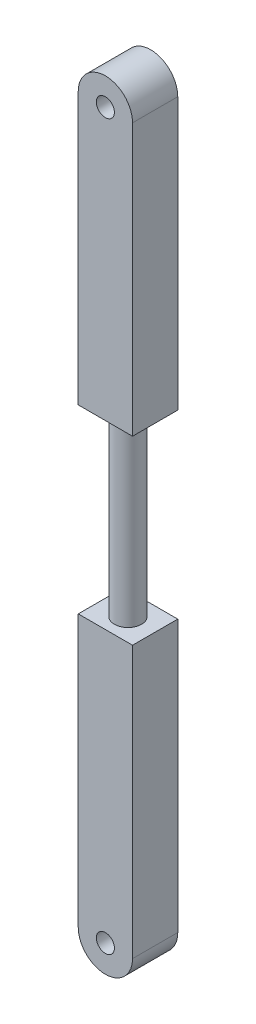
ISO-10303-21;
HEADER;
FILE_DESCRIPTION(('STEP AP214'),'2;1');
FILE_NAME('part.step','',(''),(''),'','','');
FILE_SCHEMA(('AUTOMOTIVE_DESIGN { 1 0 10303 214 1 1 1 1 }'));
ENDSEC;
DATA;
#1=APPLICATION_CONTEXT('core data for automotive mechanical design processes');
#2=APPLICATION_PROTOCOL_DEFINITION('international standard','automotive_design',2000,#1);
#3=PRODUCT_CONTEXT('',#1,'mechanical');
#4=PRODUCT('Part','Part','',(#3));
#5=PRODUCT_RELATED_PRODUCT_CATEGORY('part','',(#4));
#6=PRODUCT_DEFINITION_FORMATION('','',#4);
#7=PRODUCT_DEFINITION_CONTEXT('part definition',#1,'design');
#8=PRODUCT_DEFINITION('design','',#6,#7);
#9=PRODUCT_DEFINITION_SHAPE('','',#8);
#10=(LENGTH_UNIT() NAMED_UNIT(*) SI_UNIT(.MILLI.,.METRE.));
#11=(NAMED_UNIT(*) PLANE_ANGLE_UNIT() SI_UNIT($,.RADIAN.));
#12=(NAMED_UNIT(*) SI_UNIT($,.STERADIAN.) SOLID_ANGLE_UNIT());
#13=UNCERTAINTY_MEASURE_WITH_UNIT(LENGTH_MEASURE(1.E-05),#10,'distance_accuracy_value','');
#14=(GEOMETRIC_REPRESENTATION_CONTEXT(3) GLOBAL_UNCERTAINTY_ASSIGNED_CONTEXT((#13)) GLOBAL_UNIT_ASSIGNED_CONTEXT((#10,
#11,#12)) REPRESENTATION_CONTEXT('',''));
#15=CARTESIAN_POINT('',(0.,0.,0.));
#16=DIRECTION('',(0.,0.,1.));
#17=DIRECTION('',(1.,0.,0.));
#18=AXIS2_PLACEMENT_3D('',#15,#16,#17);
#19=CARTESIAN_POINT('',(0.,40.,2.5));
#20=DIRECTION('',(0.,0.,1.));
#21=DIRECTION('',(1.,0.,0.));
#22=AXIS2_PLACEMENT_3D('',#19,#20,#21);
#23=PLANE('',#22);
#24=CARTESIAN_POINT('',(0.,-40.,2.5));
#25=DIRECTION('',(0.,0.,1.));
#26=DIRECTION('',(1.,0.,0.));
#27=AXIS2_PLACEMENT_3D('',#24,#25,#26);
#28=CIRCLE('',#27,1.);
#29=CARTESIAN_POINT('',(1.,-40.,2.5));
#30=VERTEX_POINT('',#29);
#31=EDGE_CURVE('E172',#30,#30,#28,.T.);
#32=ORIENTED_EDGE('',*,*,#31,.F.);
#33=EDGE_LOOP('',(#32));
#34=FACE_BOUND('',#33,.T.);
#35=DIRECTION('',(0.,1.,0.));
#36=VECTOR('',#35,1.);
#37=CARTESIAN_POINT('',(3.,40.,2.5));
#38=LINE('',#37,#36);
#39=CARTESIAN_POINT('',(2.99999999999999,-40.,2.5));
#40=VERTEX_POINT('',#39);
#41=CARTESIAN_POINT('',(2.99999999999999,-10.,2.5));
#42=VERTEX_POINT('',#41);
#43=EDGE_CURVE('E120',#40,#42,#38,.T.);
#44=ORIENTED_EDGE('',*,*,#43,.T.);
#45=DIRECTION('',(-1.,0.,0.));
#46=VECTOR('',#45,1.);
#47=CARTESIAN_POINT('',(0.,-10.,2.5));
#48=LINE('',#47,#46);
#49=CARTESIAN_POINT('',(-3.,-10.,2.5));
#50=VERTEX_POINT('',#49);
#51=EDGE_CURVE('E51',#42,#50,#48,.T.);
#52=ORIENTED_EDGE('',*,*,#51,.T.);
#53=DIRECTION('',(0.,-1.,0.));
#54=VECTOR('',#53,1.);
#55=CARTESIAN_POINT('',(-3.,40.,2.5));
#56=LINE('',#55,#54);
#57=CARTESIAN_POINT('',(-3.,-40.,2.5));
#58=VERTEX_POINT('',#57);
#59=EDGE_CURVE('E182',#50,#58,#56,.T.);
#60=ORIENTED_EDGE('',*,*,#59,.T.);
#61=CARTESIAN_POINT('',(0.,-40.,2.5));
#62=DIRECTION('',(0.,0.,1.));
#63=DIRECTION('',(1.,0.,0.));
#64=AXIS2_PLACEMENT_3D('',#61,#62,#63);
#65=CIRCLE('',#64,3.);
#66=EDGE_CURVE('E121',#58,#40,#65,.T.);
#67=ORIENTED_EDGE('',*,*,#66,.T.);
#68=EDGE_LOOP('',(#44,#52,#60,#67));
#69=FACE_BOUND('',#68,.T.);
#70=ADVANCED_FACE('F37',(#34,#69),#23,.T.);
#71=CARTESIAN_POINT('',(0.,40.,-2.5));
#72=DIRECTION('',(0.,0.,1.));
#73=DIRECTION('',(1.,0.,0.));
#74=AXIS2_PLACEMENT_3D('',#71,#72,#73);
#75=PLANE('',#74);
#76=CARTESIAN_POINT('',(0.,-40.,-2.5));
#77=DIRECTION('',(0.,0.,1.));
#78=DIRECTION('',(1.,0.,0.));
#79=AXIS2_PLACEMENT_3D('',#76,#77,#78);
#80=CIRCLE('',#79,1.);
#81=CARTESIAN_POINT('',(1.,-40.,-2.5));
#82=VERTEX_POINT('',#81);
#83=EDGE_CURVE('E171',#82,#82,#80,.T.);
#84=ORIENTED_EDGE('',*,*,#83,.T.);
#85=EDGE_LOOP('',(#84));
#86=FACE_BOUND('',#85,.T.);
#87=DIRECTION('',(-1.,0.,0.));
#88=VECTOR('',#87,1.);
#89=CARTESIAN_POINT('',(0.,-10.,-2.5));
#90=LINE('',#89,#88);
#91=CARTESIAN_POINT('',(2.99999999999999,-10.,-2.5));
#92=VERTEX_POINT('',#91);
#93=CARTESIAN_POINT('',(-3.,-10.,-2.5));
#94=VERTEX_POINT('',#93);
#95=EDGE_CURVE('E166',#92,#94,#90,.T.);
#96=ORIENTED_EDGE('',*,*,#95,.F.);
#97=DIRECTION('',(0.,1.,0.));
#98=VECTOR('',#97,1.);
#99=CARTESIAN_POINT('',(3.,40.,-2.5));
#100=LINE('',#99,#98);
#101=CARTESIAN_POINT('',(2.99999999999999,-40.,-2.5));
#102=VERTEX_POINT('',#101);
#103=EDGE_CURVE('E138',#102,#92,#100,.T.);
#104=ORIENTED_EDGE('',*,*,#103,.F.);
#105=CARTESIAN_POINT('',(0.,-40.,-2.5));
#106=DIRECTION('',(0.,0.,1.));
#107=DIRECTION('',(1.,0.,0.));
#108=AXIS2_PLACEMENT_3D('',#105,#106,#107);
#109=CIRCLE('',#108,3.);
#110=CARTESIAN_POINT('',(-3.,-40.,-2.5));
#111=VERTEX_POINT('',#110);
#112=EDGE_CURVE('E135',#111,#102,#109,.T.);
#113=ORIENTED_EDGE('',*,*,#112,.F.);
#114=DIRECTION('',(0.,-1.,0.));
#115=VECTOR('',#114,1.);
#116=CARTESIAN_POINT('',(-3.,40.,-2.5));
#117=LINE('',#116,#115);
#118=EDGE_CURVE('E130',#94,#111,#117,.T.);
#119=ORIENTED_EDGE('',*,*,#118,.F.);
#120=EDGE_LOOP('',(#96,#104,#113,#119));
#121=FACE_BOUND('',#120,.T.);
#122=ADVANCED_FACE('F202',(#86,#121),#75,.F.);
#123=CARTESIAN_POINT('',(-3.,40.,2.5));
#124=DIRECTION('',(1.,0.,0.));
#125=DIRECTION('',(0.,1.,0.));
#126=AXIS2_PLACEMENT_3D('',#123,#124,#125);
#127=PLANE('',#126);
#128=DIRECTION('',(0.,0.,1.));
#129=VECTOR('',#128,1.);
#130=CARTESIAN_POINT('',(-3.00000000000001,-10.,2.5));
#131=LINE('',#130,#129);
#132=EDGE_CURVE('E169',#94,#50,#131,.T.);
#133=ORIENTED_EDGE('',*,*,#132,.F.);
#134=ORIENTED_EDGE('',*,*,#118,.T.);
#135=DIRECTION('',(0.,0.,-1.));
#136=VECTOR('',#135,1.);
#137=CARTESIAN_POINT('',(-3.,-40.,2.5));
#138=LINE('',#137,#136);
#139=EDGE_CURVE('E146',#58,#111,#138,.T.);
#140=ORIENTED_EDGE('',*,*,#139,.F.);
#141=ORIENTED_EDGE('',*,*,#59,.F.);
#142=EDGE_LOOP('',(#133,#134,#140,#141));
#143=FACE_BOUND('',#142,.T.);
#144=ADVANCED_FACE('F190',(#143),#127,.F.);
#145=CARTESIAN_POINT('',(3.,40.,2.5));
#146=DIRECTION('',(-1.,0.,0.));
#147=DIRECTION('',(0.,-1.,0.));
#148=AXIS2_PLACEMENT_3D('',#145,#146,#147);
#149=PLANE('',#148);
#150=DIRECTION('',(0.,0.,-1.));
#151=VECTOR('',#150,1.);
#152=CARTESIAN_POINT('',(2.99999999999999,-10.,2.5));
#153=LINE('',#152,#151);
#154=EDGE_CURVE('E11',#42,#92,#153,.T.);
#155=ORIENTED_EDGE('',*,*,#154,.F.);
#156=ORIENTED_EDGE('',*,*,#43,.F.);
#157=DIRECTION('',(0.,0.,-1.));
#158=VECTOR('',#157,1.);
#159=CARTESIAN_POINT('',(2.99999999999999,-40.,2.5));
#160=LINE('',#159,#158);
#161=EDGE_CURVE('E143',#40,#102,#160,.T.);
#162=ORIENTED_EDGE('',*,*,#161,.T.);
#163=ORIENTED_EDGE('',*,*,#103,.T.);
#164=EDGE_LOOP('',(#155,#156,#162,#163));
#165=FACE_BOUND('',#164,.T.);
#166=ADVANCED_FACE('F198',(#165),#149,.F.);
#167=CARTESIAN_POINT('',(0.,-40.,2.5));
#168=DIRECTION('',(0.,0.,-1.));
#169=DIRECTION('',(-1.,0.,0.));
#170=AXIS2_PLACEMENT_3D('',#167,#168,#169);
#171=CYLINDRICAL_SURFACE('',#170,3.);
#172=ORIENTED_EDGE('',*,*,#112,.T.);
#173=ORIENTED_EDGE('',*,*,#161,.F.);
#174=ORIENTED_EDGE('',*,*,#66,.F.);
#175=ORIENTED_EDGE('',*,*,#139,.T.);
#176=EDGE_LOOP('',(#172,#173,#174,#175));
#177=FACE_BOUND('',#176,.T.);
#178=ADVANCED_FACE('F194',(#177),#171,.T.);
#179=CARTESIAN_POINT('',(0.,-40.,2.5));
#180=DIRECTION('',(0.,0.,-1.));
#181=DIRECTION('',(-1.,0.,0.));
#182=AXIS2_PLACEMENT_3D('',#179,#180,#181);
#183=CYLINDRICAL_SURFACE('',#182,1.);
#184=ORIENTED_EDGE('',*,*,#31,.T.);
#185=EDGE_LOOP('',(#184));
#186=FACE_BOUND('',#185,.T.);
#187=ORIENTED_EDGE('',*,*,#83,.F.);
#188=EDGE_LOOP('',(#187));
#189=FACE_BOUND('',#188,.T.);
#190=ADVANCED_FACE('F226',(#186,#189),#183,.F.);
#191=CARTESIAN_POINT('',(0.,-10.,0.));
#192=DIRECTION('',(0.,1.,0.));
#193=DIRECTION('',(0.,0.,1.));
#194=AXIS2_PLACEMENT_3D('',#191,#192,#193);
#195=PLANE('',#194);
#196=CARTESIAN_POINT('',(0.,-10.,0.));
#197=DIRECTION('',(0.,1.,0.));
#198=DIRECTION('',(0.,0.,1.));
#199=AXIS2_PLACEMENT_3D('',#196,#197,#198);
#200=CIRCLE('',#199,1.5);
#201=CARTESIAN_POINT('',(0.,-10.,1.5));
#202=VERTEX_POINT('',#201);
#203=EDGE_CURVE('E158',#202,#202,#200,.T.);
#204=ORIENTED_EDGE('',*,*,#203,.F.);
#205=EDGE_LOOP('',(#204));
#206=FACE_BOUND('',#205,.T.);
#207=ORIENTED_EDGE('',*,*,#132,.T.);
#208=ORIENTED_EDGE('',*,*,#51,.F.);
#209=ORIENTED_EDGE('',*,*,#154,.T.);
#210=ORIENTED_EDGE('',*,*,#95,.T.);
#211=EDGE_LOOP('',(#207,#208,#209,#210));
#212=FACE_BOUND('',#211,.T.);
#213=ADVANCED_FACE('F200',(#206,#212),#195,.T.);
#214=CARTESIAN_POINT('',(0.,10.,0.));
#215=DIRECTION('',(0.,1.,0.));
#216=DIRECTION('',(0.,0.,1.));
#217=AXIS2_PLACEMENT_3D('',#214,#215,#216);
#218=PLANE('',#217);
#219=CARTESIAN_POINT('',(0.,10.,0.));
#220=DIRECTION('',(0.,1.,0.));
#221=DIRECTION('',(0.,0.,1.));
#222=AXIS2_PLACEMENT_3D('',#219,#220,#221);
#223=CIRCLE('',#222,1.5);
#224=CARTESIAN_POINT('',(0.,10.,1.5));
#225=VERTEX_POINT('',#224);
#226=EDGE_CURVE('E161',#225,#225,#223,.T.);
#227=ORIENTED_EDGE('',*,*,#226,.T.);
#228=EDGE_LOOP('',(#227));
#229=FACE_BOUND('',#228,.T.);
#230=DIRECTION('',(-1.,0.,0.));
#231=VECTOR('',#230,1.);
#232=CARTESIAN_POINT('',(0.,10.,-2.5));
#233=LINE('',#232,#231);
#234=CARTESIAN_POINT('',(3.,10.,-2.5));
#235=VERTEX_POINT('',#234);
#236=CARTESIAN_POINT('',(-3.,10.,-2.5));
#237=VERTEX_POINT('',#236);
#238=EDGE_CURVE('E59',#235,#237,#233,.T.);
#239=ORIENTED_EDGE('',*,*,#238,.F.);
#240=DIRECTION('',(0.,0.,-1.));
#241=VECTOR('',#240,1.);
#242=CARTESIAN_POINT('',(3.,10.,2.5));
#243=LINE('',#242,#241);
#244=CARTESIAN_POINT('',(3.,10.,2.5));
#245=VERTEX_POINT('',#244);
#246=EDGE_CURVE('E45',#245,#235,#243,.T.);
#247=ORIENTED_EDGE('',*,*,#246,.F.);
#248=DIRECTION('',(-1.,0.,0.));
#249=VECTOR('',#248,1.);
#250=CARTESIAN_POINT('',(0.,10.,2.5));
#251=LINE('',#250,#249);
#252=CARTESIAN_POINT('',(-3.,10.,2.5));
#253=VERTEX_POINT('',#252);
#254=EDGE_CURVE('E100',#245,#253,#251,.T.);
#255=ORIENTED_EDGE('',*,*,#254,.T.);
#256=DIRECTION('',(0.,0.,1.));
#257=VECTOR('',#256,1.);
#258=CARTESIAN_POINT('',(-3.,10.,2.5));
#259=LINE('',#258,#257);
#260=EDGE_CURVE('E114',#237,#253,#259,.T.);
#261=ORIENTED_EDGE('',*,*,#260,.F.);
#262=EDGE_LOOP('',(#239,#247,#255,#261));
#263=FACE_BOUND('',#262,.T.);
#264=ADVANCED_FACE('F99',(#229,#263),#218,.F.);
#265=CARTESIAN_POINT('',(0.,-10.,0.));
#266=DIRECTION('',(0.,1.,0.));
#267=DIRECTION('',(0.,0.,1.));
#268=AXIS2_PLACEMENT_3D('',#265,#266,#267);
#269=CYLINDRICAL_SURFACE('',#268,1.5);
#270=ORIENTED_EDGE('',*,*,#203,.T.);
#271=EDGE_LOOP('',(#270));
#272=FACE_BOUND('',#271,.T.);
#273=ORIENTED_EDGE('',*,*,#226,.F.);
#274=EDGE_LOOP('',(#273));
#275=FACE_BOUND('',#274,.T.);
#276=ADVANCED_FACE('F242',(#272,#275),#269,.T.);
#277=CARTESIAN_POINT('',(0.,40.,2.5));
#278=DIRECTION('',(0.,0.,-1.));
#279=DIRECTION('',(-1.,0.,0.));
#280=AXIS2_PLACEMENT_3D('',#277,#278,#279);
#281=CYLINDRICAL_SURFACE('',#280,1.);
#282=CARTESIAN_POINT('',(0.,40.,2.5));
#283=DIRECTION('',(0.,0.,1.));
#284=DIRECTION('',(1.,0.,0.));
#285=AXIS2_PLACEMENT_3D('',#282,#283,#284);
#286=CIRCLE('',#285,1.);
#287=CARTESIAN_POINT('',(1.,40.,2.5));
#288=VERTEX_POINT('',#287);
#289=EDGE_CURVE('E131',#288,#288,#286,.T.);
#290=ORIENTED_EDGE('',*,*,#289,.T.);
#291=EDGE_LOOP('',(#290));
#292=FACE_BOUND('',#291,.T.);
#293=CARTESIAN_POINT('',(0.,40.,-2.5));
#294=DIRECTION('',(0.,0.,1.));
#295=DIRECTION('',(1.,0.,0.));
#296=AXIS2_PLACEMENT_3D('',#293,#294,#295);
#297=CIRCLE('',#296,1.);
#298=CARTESIAN_POINT('',(1.,40.,-2.5));
#299=VERTEX_POINT('',#298);
#300=EDGE_CURVE('E175',#299,#299,#297,.T.);
#301=ORIENTED_EDGE('',*,*,#300,.F.);
#302=EDGE_LOOP('',(#301));
#303=FACE_BOUND('',#302,.T.);
#304=ADVANCED_FACE('F240',(#292,#303),#281,.F.);
#305=CARTESIAN_POINT('',(0.,40.,2.5));
#306=DIRECTION('',(0.,0.,-1.));
#307=DIRECTION('',(-1.,0.,0.));
#308=AXIS2_PLACEMENT_3D('',#305,#306,#307);
#309=CYLINDRICAL_SURFACE('',#308,3.);
#310=CARTESIAN_POINT('',(0.,40.,-2.5));
#311=DIRECTION('',(0.,0.,1.));
#312=DIRECTION('',(1.,0.,0.));
#313=AXIS2_PLACEMENT_3D('',#310,#311,#312);
#314=CIRCLE('',#313,3.);
#315=CARTESIAN_POINT('',(3.,40.,-2.5));
#316=VERTEX_POINT('',#315);
#317=CARTESIAN_POINT('',(-3.,40.,-2.5));
#318=VERTEX_POINT('',#317);
#319=EDGE_CURVE('E127',#316,#318,#314,.T.);
#320=ORIENTED_EDGE('',*,*,#319,.T.);
#321=DIRECTION('',(0.,0.,-1.));
#322=VECTOR('',#321,1.);
#323=CARTESIAN_POINT('',(-3.,40.,2.5));
#324=LINE('',#323,#322);
#325=CARTESIAN_POINT('',(-3.,40.,2.5));
#326=VERTEX_POINT('',#325);
#327=EDGE_CURVE('E105',#326,#318,#324,.T.);
#328=ORIENTED_EDGE('',*,*,#327,.F.);
#329=CARTESIAN_POINT('',(0.,40.,2.5));
#330=DIRECTION('',(0.,0.,1.));
#331=DIRECTION('',(1.,0.,0.));
#332=AXIS2_PLACEMENT_3D('',#329,#330,#331);
#333=CIRCLE('',#332,3.);
#334=CARTESIAN_POINT('',(3.,40.,2.5));
#335=VERTEX_POINT('',#334);
#336=EDGE_CURVE('E141',#335,#326,#333,.T.);
#337=ORIENTED_EDGE('',*,*,#336,.F.);
#338=DIRECTION('',(0.,0.,-1.));
#339=VECTOR('',#338,1.);
#340=CARTESIAN_POINT('',(3.,40.,2.5));
#341=LINE('',#340,#339);
#342=EDGE_CURVE('E118',#335,#316,#341,.T.);
#343=ORIENTED_EDGE('',*,*,#342,.T.);
#344=EDGE_LOOP('',(#320,#328,#337,#343));
#345=FACE_BOUND('',#344,.T.);
#346=ADVANCED_FACE('F39',(#345),#309,.T.);
#347=EDGE_CURVE('E132',#318,#237,#117,.T.);
#348=ORIENTED_EDGE('',*,*,#347,.T.);
#349=ORIENTED_EDGE('',*,*,#260,.T.);
#350=EDGE_CURVE('E113',#326,#253,#56,.T.);
#351=ORIENTED_EDGE('',*,*,#350,.F.);
#352=ORIENTED_EDGE('',*,*,#327,.T.);
#353=EDGE_LOOP('',(#348,#349,#351,#352));
#354=FACE_BOUND('',#353,.T.);
#355=ADVANCED_FACE('F152',(#354),#127,.F.);
#356=EDGE_CURVE('E111',#245,#335,#38,.T.);
#357=ORIENTED_EDGE('',*,*,#356,.F.);
#358=ORIENTED_EDGE('',*,*,#246,.T.);
#359=EDGE_CURVE('E137',#235,#316,#100,.T.);
#360=ORIENTED_EDGE('',*,*,#359,.T.);
#361=ORIENTED_EDGE('',*,*,#342,.F.);
#362=EDGE_LOOP('',(#357,#358,#360,#361));
#363=FACE_BOUND('',#362,.T.);
#364=ADVANCED_FACE('F116',(#363),#149,.F.);
#365=ORIENTED_EDGE('',*,*,#359,.F.);
#366=ORIENTED_EDGE('',*,*,#238,.T.);
#367=ORIENTED_EDGE('',*,*,#347,.F.);
#368=ORIENTED_EDGE('',*,*,#319,.F.);
#369=EDGE_LOOP('',(#365,#366,#367,#368));
#370=FACE_BOUND('',#369,.T.);
#371=ORIENTED_EDGE('',*,*,#300,.T.);
#372=EDGE_LOOP('',(#371));
#373=FACE_BOUND('',#372,.T.);
#374=ADVANCED_FACE('F156',(#370,#373),#75,.F.);
#375=ORIENTED_EDGE('',*,*,#254,.F.);
#376=ORIENTED_EDGE('',*,*,#356,.T.);
#377=ORIENTED_EDGE('',*,*,#336,.T.);
#378=ORIENTED_EDGE('',*,*,#350,.T.);
#379=EDGE_LOOP('',(#375,#376,#377,#378));
#380=FACE_BOUND('',#379,.T.);
#381=ORIENTED_EDGE('',*,*,#289,.F.);
#382=EDGE_LOOP('',(#381));
#383=FACE_BOUND('',#382,.T.);
#384=ADVANCED_FACE('F108',(#380,#383),#23,.T.);
#385=CLOSED_SHELL('',(#70,#122,#144,#166,#178,#190,#213,#264,#276,#304,#346,#355,#364,#374,#384));
#386=MANIFOLD_SOLID_BREP('B2',#385);
#387=ADVANCED_BREP_SHAPE_REPRESENTATION('',(#18,#386),#14);
#388=SHAPE_DEFINITION_REPRESENTATION(#9,#387);
ENDSEC;
END-ISO-10303-21;
